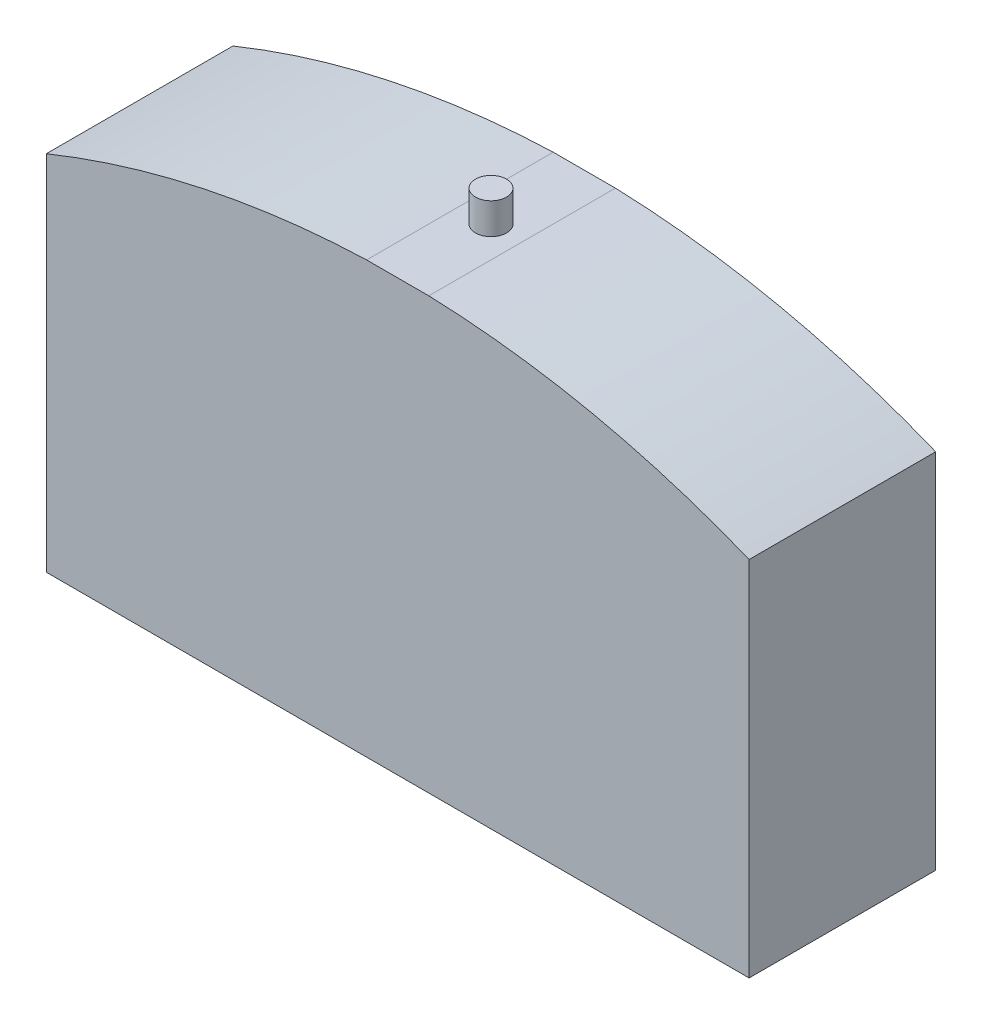
ISO-10303-21;
HEADER;
FILE_DESCRIPTION(('STEP AP214'),'2;1');
FILE_NAME('part.step','',(''),(''),'','','');
FILE_SCHEMA(('AUTOMOTIVE_DESIGN { 1 0 10303 214 1 1 1 1 }'));
ENDSEC;
DATA;
#1=APPLICATION_CONTEXT('core data for automotive mechanical design processes');
#2=APPLICATION_PROTOCOL_DEFINITION('international standard','automotive_design',2000,#1);
#3=PRODUCT_CONTEXT('',#1,'mechanical');
#4=PRODUCT('Part','Part','',(#3));
#5=PRODUCT_RELATED_PRODUCT_CATEGORY('part','',(#4));
#6=PRODUCT_DEFINITION_FORMATION('','',#4);
#7=PRODUCT_DEFINITION_CONTEXT('part definition',#1,'design');
#8=PRODUCT_DEFINITION('design','',#6,#7);
#9=PRODUCT_DEFINITION_SHAPE('','',#8);
#10=(LENGTH_UNIT() NAMED_UNIT(*) SI_UNIT(.MILLI.,.METRE.));
#11=(NAMED_UNIT(*) PLANE_ANGLE_UNIT() SI_UNIT($,.RADIAN.));
#12=(NAMED_UNIT(*) SI_UNIT($,.STERADIAN.) SOLID_ANGLE_UNIT());
#13=UNCERTAINTY_MEASURE_WITH_UNIT(LENGTH_MEASURE(1.E-05),#10,'distance_accuracy_value','');
#14=(GEOMETRIC_REPRESENTATION_CONTEXT(3) GLOBAL_UNCERTAINTY_ASSIGNED_CONTEXT((#13)) GLOBAL_UNIT_ASSIGNED_CONTEXT((#10,
#11,#12)) REPRESENTATION_CONTEXT('',''));
#15=CARTESIAN_POINT('',(0.,0.,0.));
#16=DIRECTION('',(0.,0.,1.));
#17=DIRECTION('',(1.,0.,0.));
#18=AXIS2_PLACEMENT_3D('',#15,#16,#17);
#19=CARTESIAN_POINT('',(0.,0.,30.));
#20=DIRECTION('',(0.,0.,-1.));
#21=DIRECTION('',(-1.,0.,0.));
#22=AXIS2_PLACEMENT_3D('',#19,#20,#21);
#23=CYLINDRICAL_SURFACE('',#22,150.);
#24=CARTESIAN_POINT('',(0.,0.,0.));
#25=DIRECTION('',(0.,0.,1.));
#26=DIRECTION('',(1.,0.,0.));
#27=AXIS2_PLACEMENT_3D('',#24,#25,#26);
#28=CIRCLE('',#27,150.);
#29=CARTESIAN_POINT('',(-5.,149.916643505649,0.));
#30=VERTEX_POINT('',#29);
#31=CARTESIAN_POINT('',(-56.5,138.952329955276,0.));
#32=VERTEX_POINT('',#31);
#33=EDGE_CURVE('E135',#30,#32,#28,.T.);
#34=ORIENTED_EDGE('',*,*,#33,.T.);
#35=DIRECTION('',(0.,0.,-1.));
#36=VECTOR('',#35,1.);
#37=CARTESIAN_POINT('',(-56.5,138.952329955276,30.));
#38=LINE('',#37,#36);
#39=CARTESIAN_POINT('',(-56.5,138.952329955276,30.));
#40=VERTEX_POINT('',#39);
#41=EDGE_CURVE('E40',#40,#32,#38,.T.);
#42=ORIENTED_EDGE('',*,*,#41,.F.);
#43=CARTESIAN_POINT('',(0.,0.,30.));
#44=DIRECTION('',(0.,0.,1.));
#45=DIRECTION('',(1.,0.,0.));
#46=AXIS2_PLACEMENT_3D('',#43,#44,#45);
#47=CIRCLE('',#46,150.);
#48=CARTESIAN_POINT('',(-5.,149.916643505649,30.));
#49=VERTEX_POINT('',#48);
#50=EDGE_CURVE('E147',#49,#40,#47,.T.);
#51=ORIENTED_EDGE('',*,*,#50,.F.);
#52=DIRECTION('',(0.,0.,-1.));
#53=VECTOR('',#52,1.);
#54=CARTESIAN_POINT('',(-5.,149.916643505649,30.));
#55=LINE('',#54,#53);
#56=EDGE_CURVE('E131',#49,#30,#55,.T.);
#57=ORIENTED_EDGE('',*,*,#56,.T.);
#58=EDGE_LOOP('',(#34,#42,#51,#57));
#59=FACE_BOUND('',#58,.T.);
#60=ADVANCED_FACE('F37',(#59),#23,.T.);
#61=CARTESIAN_POINT('',(-56.5,138.952329955276,30.));
#62=DIRECTION('',(1.,0.,0.));
#63=DIRECTION('',(0.,1.,0.));
#64=AXIS2_PLACEMENT_3D('',#61,#62,#63);
#65=PLANE('',#64);
#66=DIRECTION('',(0.,-1.,0.));
#67=VECTOR('',#66,1.);
#68=CARTESIAN_POINT('',(-56.5,138.952329955276,0.));
#69=LINE('',#68,#67);
#70=CARTESIAN_POINT('',(-56.5,80.6823299552764,0.));
#71=VERTEX_POINT('',#70);
#72=EDGE_CURVE('E138',#32,#71,#69,.T.);
#73=ORIENTED_EDGE('',*,*,#72,.T.);
#74=DIRECTION('',(0.,0.,-1.));
#75=VECTOR('',#74,1.);
#76=CARTESIAN_POINT('',(-56.5,80.6823299552764,30.));
#77=LINE('',#76,#75);
#78=CARTESIAN_POINT('',(-56.5,80.6823299552764,30.));
#79=VERTEX_POINT('',#78);
#80=EDGE_CURVE('E150',#79,#71,#77,.T.);
#81=ORIENTED_EDGE('',*,*,#80,.F.);
#82=DIRECTION('',(0.,-1.,0.));
#83=VECTOR('',#82,1.);
#84=CARTESIAN_POINT('',(-56.5,138.952329955276,30.));
#85=LINE('',#84,#83);
#86=EDGE_CURVE('E97',#40,#79,#85,.T.);
#87=ORIENTED_EDGE('',*,*,#86,.F.);
#88=ORIENTED_EDGE('',*,*,#41,.T.);
#89=EDGE_LOOP('',(#73,#81,#87,#88));
#90=FACE_BOUND('',#89,.T.);
#91=ADVANCED_FACE('F155',(#90),#65,.F.);
#92=CARTESIAN_POINT('',(-56.5,80.6823299552764,30.));
#93=DIRECTION('',(0.,1.,0.));
#94=DIRECTION('',(0.,0.,1.));
#95=AXIS2_PLACEMENT_3D('',#92,#93,#94);
#96=PLANE('',#95);
#97=DIRECTION('',(1.,0.,0.));
#98=VECTOR('',#97,1.);
#99=CARTESIAN_POINT('',(-56.5,80.6823299552764,0.));
#100=LINE('',#99,#98);
#101=CARTESIAN_POINT('',(56.5,80.6823299552764,0.));
#102=VERTEX_POINT('',#101);
#103=EDGE_CURVE('E141',#71,#102,#100,.T.);
#104=ORIENTED_EDGE('',*,*,#103,.T.);
#105=DIRECTION('',(0.,0.,-1.));
#106=VECTOR('',#105,1.);
#107=CARTESIAN_POINT('',(56.5,80.6823299552764,30.));
#108=LINE('',#107,#106);
#109=CARTESIAN_POINT('',(56.5,80.6823299552764,30.));
#110=VERTEX_POINT('',#109);
#111=EDGE_CURVE('E126',#110,#102,#108,.T.);
#112=ORIENTED_EDGE('',*,*,#111,.F.);
#113=DIRECTION('',(1.,0.,0.));
#114=VECTOR('',#113,1.);
#115=CARTESIAN_POINT('',(-56.5,80.6823299552764,30.));
#116=LINE('',#115,#114);
#117=EDGE_CURVE('E114',#79,#110,#116,.T.);
#118=ORIENTED_EDGE('',*,*,#117,.F.);
#119=ORIENTED_EDGE('',*,*,#80,.T.);
#120=EDGE_LOOP('',(#104,#112,#118,#119));
#121=FACE_BOUND('',#120,.T.);
#122=ADVANCED_FACE('F161',(#121),#96,.F.);
#123=CARTESIAN_POINT('',(56.5,138.952329955276,30.));
#124=DIRECTION('',(-1.,0.,0.));
#125=DIRECTION('',(0.,0.,1.));
#126=AXIS2_PLACEMENT_3D('',#123,#124,#125);
#127=PLANE('',#126);
#128=DIRECTION('',(0.,1.,0.));
#129=VECTOR('',#128,1.);
#130=CARTESIAN_POINT('',(56.5,138.952329955276,0.));
#131=LINE('',#130,#129);
#132=CARTESIAN_POINT('',(56.5,138.952329955276,0.));
#133=VERTEX_POINT('',#132);
#134=EDGE_CURVE('E123',#102,#133,#131,.T.);
#135=ORIENTED_EDGE('',*,*,#134,.T.);
#136=DIRECTION('',(0.,0.,-1.));
#137=VECTOR('',#136,1.);
#138=CARTESIAN_POINT('',(56.5,138.952329955276,30.));
#139=LINE('',#138,#137);
#140=CARTESIAN_POINT('',(56.5,138.952329955276,30.));
#141=VERTEX_POINT('',#140);
#142=EDGE_CURVE('E120',#141,#133,#139,.T.);
#143=ORIENTED_EDGE('',*,*,#142,.F.);
#144=DIRECTION('',(0.,1.,0.));
#145=VECTOR('',#144,1.);
#146=CARTESIAN_POINT('',(56.5,138.952329955276,30.));
#147=LINE('',#146,#145);
#148=EDGE_CURVE('E107',#110,#141,#147,.T.);
#149=ORIENTED_EDGE('',*,*,#148,.F.);
#150=ORIENTED_EDGE('',*,*,#111,.T.);
#151=EDGE_LOOP('',(#135,#143,#149,#150));
#152=FACE_BOUND('',#151,.T.);
#153=ADVANCED_FACE('F121',(#152),#127,.F.);
#154=CARTESIAN_POINT('',(0.,0.,30.));
#155=DIRECTION('',(0.,0.,-1.));
#156=DIRECTION('',(-1.,0.,0.));
#157=AXIS2_PLACEMENT_3D('',#154,#155,#156);
#158=CYLINDRICAL_SURFACE('',#157,150.);
#159=CARTESIAN_POINT('',(0.,0.,0.));
#160=DIRECTION('',(0.,0.,1.));
#161=DIRECTION('',(1.,0.,0.));
#162=AXIS2_PLACEMENT_3D('',#159,#160,#161);
#163=CIRCLE('',#162,150.);
#164=CARTESIAN_POINT('',(5.,149.916643505649,0.));
#165=VERTEX_POINT('',#164);
#166=EDGE_CURVE('E144',#133,#165,#163,.T.);
#167=ORIENTED_EDGE('',*,*,#166,.T.);
#168=DIRECTION('',(0.,0.,-1.));
#169=VECTOR('',#168,1.);
#170=CARTESIAN_POINT('',(5.,149.916643505649,30.));
#171=LINE('',#170,#169);
#172=CARTESIAN_POINT('',(5.,149.916643505649,30.));
#173=VERTEX_POINT('',#172);
#174=EDGE_CURVE('E127',#173,#165,#171,.T.);
#175=ORIENTED_EDGE('',*,*,#174,.F.);
#176=CARTESIAN_POINT('',(0.,0.,30.));
#177=DIRECTION('',(0.,0.,1.));
#178=DIRECTION('',(1.,0.,0.));
#179=AXIS2_PLACEMENT_3D('',#176,#177,#178);
#180=CIRCLE('',#179,150.);
#181=EDGE_CURVE('E111',#141,#173,#180,.T.);
#182=ORIENTED_EDGE('',*,*,#181,.F.);
#183=ORIENTED_EDGE('',*,*,#142,.T.);
#184=EDGE_LOOP('',(#167,#175,#182,#183));
#185=FACE_BOUND('',#184,.T.);
#186=ADVANCED_FACE('F129',(#185),#158,.T.);
#187=CARTESIAN_POINT('',(-5.,149.916643505649,30.));
#188=DIRECTION('',(0.,-1.,0.));
#189=DIRECTION('',(0.,0.,-1.));
#190=AXIS2_PLACEMENT_3D('',#187,#188,#189);
#191=PLANE('',#190);
#192=CARTESIAN_POINT('',(0.,149.916643505649,15.));
#193=DIRECTION('',(0.,1.,0.));
#194=DIRECTION('',(0.,0.,1.));
#195=AXIS2_PLACEMENT_3D('',#192,#193,#194);
#196=CIRCLE('',#195,2.5);
#197=CARTESIAN_POINT('',(0.,149.916643505649,17.5));
#198=VERTEX_POINT('',#197);
#199=EDGE_CURVE('E11',#198,#198,#196,.T.);
#200=ORIENTED_EDGE('',*,*,#199,.F.);
#201=EDGE_LOOP('',(#200));
#202=FACE_BOUND('',#201,.T.);
#203=DIRECTION('',(-1.,0.,0.));
#204=VECTOR('',#203,1.);
#205=CARTESIAN_POINT('',(-5.,149.916643505649,0.));
#206=LINE('',#205,#204);
#207=EDGE_CURVE('E88',#165,#30,#206,.T.);
#208=ORIENTED_EDGE('',*,*,#207,.T.);
#209=ORIENTED_EDGE('',*,*,#56,.F.);
#210=DIRECTION('',(-1.,0.,0.));
#211=VECTOR('',#210,1.);
#212=CARTESIAN_POINT('',(-5.,149.916643505649,30.));
#213=LINE('',#212,#211);
#214=EDGE_CURVE('E61',#173,#49,#213,.T.);
#215=ORIENTED_EDGE('',*,*,#214,.F.);
#216=ORIENTED_EDGE('',*,*,#174,.T.);
#217=EDGE_LOOP('',(#208,#209,#215,#216));
#218=FACE_BOUND('',#217,.T.);
#219=ADVANCED_FACE('F227',(#202,#218),#191,.F.);
#220=CARTESIAN_POINT('',(0.,0.,30.));
#221=DIRECTION('',(0.,0.,1.));
#222=DIRECTION('',(1.,0.,0.));
#223=AXIS2_PLACEMENT_3D('',#220,#221,#222);
#224=PLANE('',#223);
#225=ORIENTED_EDGE('',*,*,#50,.T.);
#226=ORIENTED_EDGE('',*,*,#86,.T.);
#227=ORIENTED_EDGE('',*,*,#117,.T.);
#228=ORIENTED_EDGE('',*,*,#148,.T.);
#229=ORIENTED_EDGE('',*,*,#181,.T.);
#230=ORIENTED_EDGE('',*,*,#214,.T.);
#231=EDGE_LOOP('',(#225,#226,#227,#228,#229,#230));
#232=FACE_BOUND('',#231,.T.);
#233=ADVANCED_FACE('F109',(#232),#224,.T.);
#234=CARTESIAN_POINT('',(0.,0.,0.));
#235=DIRECTION('',(0.,0.,1.));
#236=DIRECTION('',(1.,0.,0.));
#237=AXIS2_PLACEMENT_3D('',#234,#235,#236);
#238=PLANE('',#237);
#239=DIRECTION('',(1.,0.,0.));
#240=VECTOR('',#239,1.);
#241=CARTESIAN_POINT('',(-4.94973343059102,146.916643505649,0.));
#242=LINE('',#241,#240);
#243=CARTESIAN_POINT('',(-4.94973343059102,146.916643505649,0.));
#244=VERTEX_POINT('',#243);
#245=CARTESIAN_POINT('',(4.94973343059103,146.916643505649,0.));
#246=VERTEX_POINT('',#245);
#247=EDGE_CURVE('E194',#244,#246,#242,.T.);
#248=ORIENTED_EDGE('',*,*,#247,.F.);
#249=CARTESIAN_POINT('',(0.,0.,0.));
#250=DIRECTION('',(0.,0.,-1.));
#251=DIRECTION('',(-1.,0.,0.));
#252=AXIS2_PLACEMENT_3D('',#249,#250,#251);
#253=CIRCLE('',#252,147.);
#254=CARTESIAN_POINT('',(-53.5,136.918771539917,0.));
#255=VERTEX_POINT('',#254);
#256=EDGE_CURVE('E52',#255,#244,#253,.T.);
#257=ORIENTED_EDGE('',*,*,#256,.F.);
#258=DIRECTION('',(0.,1.,0.));
#259=VECTOR('',#258,1.);
#260=CARTESIAN_POINT('',(-53.5,83.6823299552764,0.));
#261=LINE('',#260,#259);
#262=CARTESIAN_POINT('',(-53.5,83.6823299552764,0.));
#263=VERTEX_POINT('',#262);
#264=EDGE_CURVE('E181',#263,#255,#261,.T.);
#265=ORIENTED_EDGE('',*,*,#264,.F.);
#266=DIRECTION('',(-1.,0.,0.));
#267=VECTOR('',#266,1.);
#268=CARTESIAN_POINT('',(53.5,83.6823299552764,0.));
#269=LINE('',#268,#267);
#270=CARTESIAN_POINT('',(53.5,83.6823299552764,0.));
#271=VERTEX_POINT('',#270);
#272=EDGE_CURVE('E185',#271,#263,#269,.T.);
#273=ORIENTED_EDGE('',*,*,#272,.F.);
#274=DIRECTION('',(0.,-1.,0.));
#275=VECTOR('',#274,1.);
#276=CARTESIAN_POINT('',(53.5,136.918771539917,0.));
#277=LINE('',#276,#275);
#278=CARTESIAN_POINT('',(53.5,136.918771539917,0.));
#279=VERTEX_POINT('',#278);
#280=EDGE_CURVE('E188',#279,#271,#277,.T.);
#281=ORIENTED_EDGE('',*,*,#280,.F.);
#282=CARTESIAN_POINT('',(0.,0.,0.));
#283=DIRECTION('',(0.,0.,-1.));
#284=DIRECTION('',(-1.,0.,0.));
#285=AXIS2_PLACEMENT_3D('',#282,#283,#284);
#286=CIRCLE('',#285,147.);
#287=EDGE_CURVE('E191',#246,#279,#286,.T.);
#288=ORIENTED_EDGE('',*,*,#287,.F.);
#289=EDGE_LOOP('',(#248,#257,#265,#273,#281,#288));
#290=FACE_BOUND('',#289,.T.);
#291=ORIENTED_EDGE('',*,*,#33,.F.);
#292=ORIENTED_EDGE('',*,*,#207,.F.);
#293=ORIENTED_EDGE('',*,*,#166,.F.);
#294=ORIENTED_EDGE('',*,*,#134,.F.);
#295=ORIENTED_EDGE('',*,*,#103,.F.);
#296=ORIENTED_EDGE('',*,*,#72,.F.);
#297=EDGE_LOOP('',(#291,#292,#293,#294,#295,#296));
#298=FACE_BOUND('',#297,.T.);
#299=ADVANCED_FACE('F160',(#290,#298),#238,.F.);
#300=CARTESIAN_POINT('',(0.,0.,27.));
#301=DIRECTION('',(0.,0.,-1.));
#302=DIRECTION('',(-1.,0.,0.));
#303=AXIS2_PLACEMENT_3D('',#300,#301,#302);
#304=CYLINDRICAL_SURFACE('',#303,147.);
#305=ORIENTED_EDGE('',*,*,#256,.T.);
#306=DIRECTION('',(0.,0.,-1.));
#307=VECTOR('',#306,1.);
#308=CARTESIAN_POINT('',(-4.94973343059102,146.916643505649,27.));
#309=LINE('',#308,#307);
#310=CARTESIAN_POINT('',(-4.94973343059102,146.916643505649,27.));
#311=VERTEX_POINT('',#310);
#312=EDGE_CURVE('E165',#311,#244,#309,.T.);
#313=ORIENTED_EDGE('',*,*,#312,.F.);
#314=CARTESIAN_POINT('',(0.,0.,27.));
#315=DIRECTION('',(0.,0.,-1.));
#316=DIRECTION('',(-1.,0.,0.));
#317=AXIS2_PLACEMENT_3D('',#314,#315,#316);
#318=CIRCLE('',#317,147.);
#319=CARTESIAN_POINT('',(-53.5,136.918771539917,27.));
#320=VERTEX_POINT('',#319);
#321=EDGE_CURVE('E184',#320,#311,#318,.T.);
#322=ORIENTED_EDGE('',*,*,#321,.F.);
#323=DIRECTION('',(0.,0.,-1.));
#324=VECTOR('',#323,1.);
#325=CARTESIAN_POINT('',(-53.5,136.918771539917,27.));
#326=LINE('',#325,#324);
#327=EDGE_CURVE('E139',#320,#255,#326,.T.);
#328=ORIENTED_EDGE('',*,*,#327,.T.);
#329=EDGE_LOOP('',(#305,#313,#322,#328));
#330=FACE_BOUND('',#329,.T.);
#331=ADVANCED_FACE('F273',(#330),#304,.F.);
#332=CARTESIAN_POINT('',(-53.5,83.6823299552764,27.));
#333=DIRECTION('',(-1.,0.,0.));
#334=DIRECTION('',(0.,-1.,0.));
#335=AXIS2_PLACEMENT_3D('',#332,#333,#334);
#336=PLANE('',#335);
#337=ORIENTED_EDGE('',*,*,#264,.T.);
#338=ORIENTED_EDGE('',*,*,#327,.F.);
#339=DIRECTION('',(0.,1.,0.));
#340=VECTOR('',#339,1.);
#341=CARTESIAN_POINT('',(-53.5,83.6823299552764,27.));
#342=LINE('',#341,#340);
#343=CARTESIAN_POINT('',(-53.5,83.6823299552764,27.));
#344=VERTEX_POINT('',#343);
#345=EDGE_CURVE('E168',#344,#320,#342,.T.);
#346=ORIENTED_EDGE('',*,*,#345,.F.);
#347=DIRECTION('',(0.,0.,-1.));
#348=VECTOR('',#347,1.);
#349=CARTESIAN_POINT('',(-53.5,83.6823299552764,27.));
#350=LINE('',#349,#348);
#351=EDGE_CURVE('E177',#344,#263,#350,.T.);
#352=ORIENTED_EDGE('',*,*,#351,.T.);
#353=EDGE_LOOP('',(#337,#338,#346,#352));
#354=FACE_BOUND('',#353,.T.);
#355=ADVANCED_FACE('F283',(#354),#336,.F.);
#356=CARTESIAN_POINT('',(53.5,83.6823299552764,27.));
#357=DIRECTION('',(0.,-1.,0.));
#358=DIRECTION('',(0.,0.,-1.));
#359=AXIS2_PLACEMENT_3D('',#356,#357,#358);
#360=PLANE('',#359);
#361=ORIENTED_EDGE('',*,*,#272,.T.);
#362=ORIENTED_EDGE('',*,*,#351,.F.);
#363=DIRECTION('',(-1.,0.,0.));
#364=VECTOR('',#363,1.);
#365=CARTESIAN_POINT('',(53.5,83.6823299552764,27.));
#366=LINE('',#365,#364);
#367=CARTESIAN_POINT('',(53.5,83.6823299552764,27.));
#368=VERTEX_POINT('',#367);
#369=EDGE_CURVE('E201',#368,#344,#366,.T.);
#370=ORIENTED_EDGE('',*,*,#369,.F.);
#371=DIRECTION('',(0.,0.,-1.));
#372=VECTOR('',#371,1.);
#373=CARTESIAN_POINT('',(53.5,83.6823299552764,27.));
#374=LINE('',#373,#372);
#375=EDGE_CURVE('E174',#368,#271,#374,.T.);
#376=ORIENTED_EDGE('',*,*,#375,.T.);
#377=EDGE_LOOP('',(#361,#362,#370,#376));
#378=FACE_BOUND('',#377,.T.);
#379=ADVANCED_FACE('F293',(#378),#360,.F.);
#380=CARTESIAN_POINT('',(53.5,136.918771539917,27.));
#381=DIRECTION('',(1.,0.,0.));
#382=DIRECTION('',(0.,1.,0.));
#383=AXIS2_PLACEMENT_3D('',#380,#381,#382);
#384=PLANE('',#383);
#385=ORIENTED_EDGE('',*,*,#280,.T.);
#386=ORIENTED_EDGE('',*,*,#375,.F.);
#387=DIRECTION('',(0.,-1.,0.));
#388=VECTOR('',#387,1.);
#389=CARTESIAN_POINT('',(53.5,136.918771539917,27.));
#390=LINE('',#389,#388);
#391=CARTESIAN_POINT('',(53.5,136.918771539917,27.));
#392=VERTEX_POINT('',#391);
#393=EDGE_CURVE('E204',#392,#368,#390,.T.);
#394=ORIENTED_EDGE('',*,*,#393,.F.);
#395=DIRECTION('',(0.,0.,-1.));
#396=VECTOR('',#395,1.);
#397=CARTESIAN_POINT('',(53.5,136.918771539917,27.));
#398=LINE('',#397,#396);
#399=EDGE_CURVE('E171',#392,#279,#398,.T.);
#400=ORIENTED_EDGE('',*,*,#399,.T.);
#401=EDGE_LOOP('',(#385,#386,#394,#400));
#402=FACE_BOUND('',#401,.T.);
#403=ADVANCED_FACE('F304',(#402),#384,.F.);
#404=CARTESIAN_POINT('',(0.,0.,27.));
#405=DIRECTION('',(0.,0.,-1.));
#406=DIRECTION('',(-1.,0.,0.));
#407=AXIS2_PLACEMENT_3D('',#404,#405,#406);
#408=CYLINDRICAL_SURFACE('',#407,147.);
#409=ORIENTED_EDGE('',*,*,#287,.T.);
#410=ORIENTED_EDGE('',*,*,#399,.F.);
#411=CARTESIAN_POINT('',(0.,0.,27.));
#412=DIRECTION('',(0.,0.,-1.));
#413=DIRECTION('',(-1.,0.,0.));
#414=AXIS2_PLACEMENT_3D('',#411,#412,#413);
#415=CIRCLE('',#414,147.);
#416=CARTESIAN_POINT('',(4.94973343059103,146.916643505649,27.));
#417=VERTEX_POINT('',#416);
#418=EDGE_CURVE('E207',#417,#392,#415,.T.);
#419=ORIENTED_EDGE('',*,*,#418,.F.);
#420=DIRECTION('',(0.,0.,-1.));
#421=VECTOR('',#420,1.);
#422=CARTESIAN_POINT('',(4.94973343059103,146.916643505649,27.));
#423=LINE('',#422,#421);
#424=EDGE_CURVE('E167',#417,#246,#423,.T.);
#425=ORIENTED_EDGE('',*,*,#424,.T.);
#426=EDGE_LOOP('',(#409,#410,#419,#425));
#427=FACE_BOUND('',#426,.T.);
#428=ADVANCED_FACE('F315',(#427),#408,.F.);
#429=CARTESIAN_POINT('',(-4.94973343059102,146.916643505649,27.));
#430=DIRECTION('',(0.,1.,0.));
#431=DIRECTION('',(0.,0.,1.));
#432=AXIS2_PLACEMENT_3D('',#429,#430,#431);
#433=PLANE('',#432);
#434=ORIENTED_EDGE('',*,*,#247,.T.);
#435=ORIENTED_EDGE('',*,*,#424,.F.);
#436=DIRECTION('',(1.,0.,0.));
#437=VECTOR('',#436,1.);
#438=CARTESIAN_POINT('',(-4.94973343059102,146.916643505649,27.));
#439=LINE('',#438,#437);
#440=EDGE_CURVE('E210',#311,#417,#439,.T.);
#441=ORIENTED_EDGE('',*,*,#440,.F.);
#442=ORIENTED_EDGE('',*,*,#312,.T.);
#443=EDGE_LOOP('',(#434,#435,#441,#442));
#444=FACE_BOUND('',#443,.T.);
#445=ADVANCED_FACE('F326',(#444),#433,.F.);
#446=CARTESIAN_POINT('',(0.,0.,27.));
#447=DIRECTION('',(0.,0.,-1.));
#448=DIRECTION('',(-1.,0.,0.));
#449=AXIS2_PLACEMENT_3D('',#446,#447,#448);
#450=PLANE('',#449);
#451=ORIENTED_EDGE('',*,*,#321,.T.);
#452=ORIENTED_EDGE('',*,*,#440,.T.);
#453=ORIENTED_EDGE('',*,*,#418,.T.);
#454=ORIENTED_EDGE('',*,*,#393,.T.);
#455=ORIENTED_EDGE('',*,*,#369,.T.);
#456=ORIENTED_EDGE('',*,*,#345,.T.);
#457=EDGE_LOOP('',(#451,#452,#453,#454,#455,#456));
#458=FACE_BOUND('',#457,.T.);
#459=ADVANCED_FACE('F223',(#458),#450,.T.);
#460=CARTESIAN_POINT('',(0.,154.916643505649,15.));
#461=DIRECTION('',(0.,-1.,0.));
#462=DIRECTION('',(0.,0.,-1.));
#463=AXIS2_PLACEMENT_3D('',#460,#461,#462);
#464=CYLINDRICAL_SURFACE('',#463,2.5);
#465=CARTESIAN_POINT('',(0.,154.916643505649,15.));
#466=DIRECTION('',(0.,1.,0.));
#467=DIRECTION('',(0.,0.,1.));
#468=AXIS2_PLACEMENT_3D('',#465,#466,#467);
#469=CIRCLE('',#468,2.5);
#470=CARTESIAN_POINT('',(0.,154.916643505649,17.5));
#471=VERTEX_POINT('',#470);
#472=EDGE_CURVE('E198',#471,#471,#469,.T.);
#473=ORIENTED_EDGE('',*,*,#472,.F.);
#474=EDGE_LOOP('',(#473));
#475=FACE_BOUND('',#474,.T.);
#476=ORIENTED_EDGE('',*,*,#199,.T.);
#477=EDGE_LOOP('',(#476));
#478=FACE_BOUND('',#477,.T.);
#479=ADVANCED_FACE('F220',(#475,#478),#464,.T.);
#480=CARTESIAN_POINT('',(0.,154.916643505649,15.));
#481=DIRECTION('',(0.,1.,0.));
#482=DIRECTION('',(0.,0.,1.));
#483=AXIS2_PLACEMENT_3D('',#480,#481,#482);
#484=PLANE('',#483);
#485=ORIENTED_EDGE('',*,*,#472,.T.);
#486=EDGE_LOOP('',(#485));
#487=FACE_BOUND('',#486,.T.);
#488=ADVANCED_FACE('F218',(#487),#484,.T.);
#489=CLOSED_SHELL('',(#60,#91,#122,#153,#186,#219,#233,#299,#331,#355,#379,#403,#428,#445,#459,
#479,#488));
#490=MANIFOLD_SOLID_BREP('B2',#489);
#491=ADVANCED_BREP_SHAPE_REPRESENTATION('',(#18,#490),#14);
#492=SHAPE_DEFINITION_REPRESENTATION(#9,#491);
ENDSEC;
END-ISO-10303-21;
